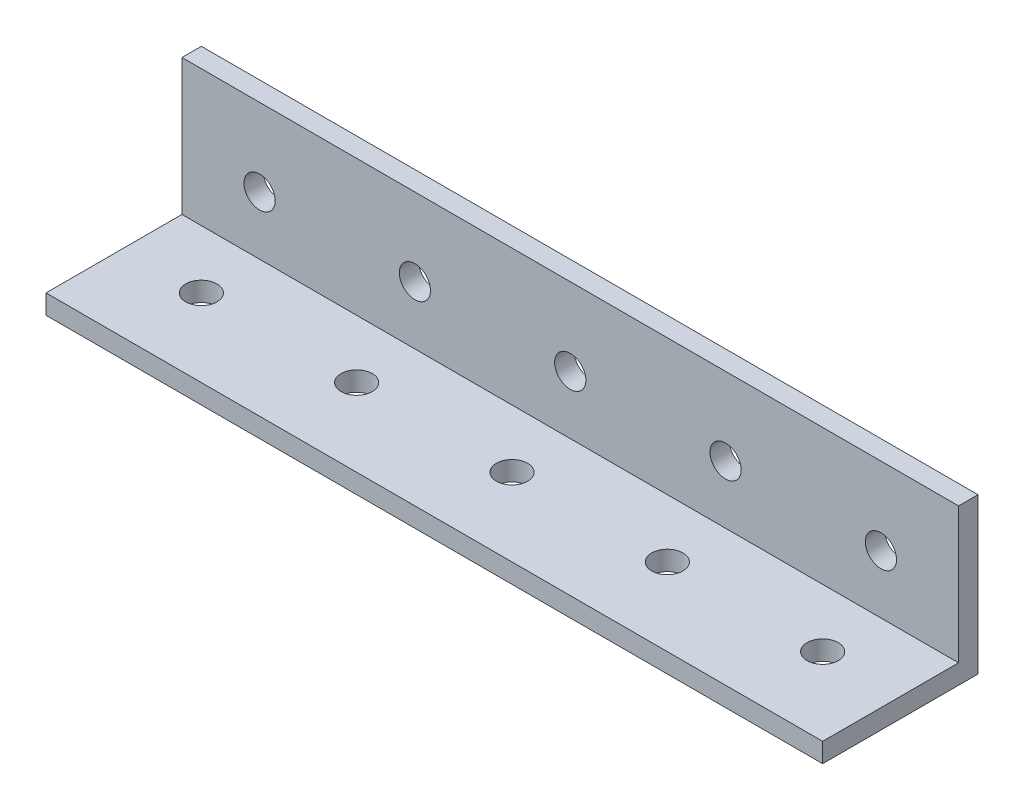
ISO-10303-21;
HEADER;
FILE_DESCRIPTION(('STEP AP214'),'2;1');
FILE_NAME('part.step','',(''),(''),'','','');
FILE_SCHEMA(('AUTOMOTIVE_DESIGN { 1 0 10303 214 1 1 1 1 }'));
ENDSEC;
DATA;
#1=APPLICATION_CONTEXT('core data for automotive mechanical design processes');
#2=APPLICATION_PROTOCOL_DEFINITION('international standard','automotive_design',2000,#1);
#3=PRODUCT_CONTEXT('',#1,'mechanical');
#4=PRODUCT('Part','Part','',(#3));
#5=PRODUCT_RELATED_PRODUCT_CATEGORY('part','',(#4));
#6=PRODUCT_DEFINITION_FORMATION('','',#4);
#7=PRODUCT_DEFINITION_CONTEXT('part definition',#1,'design');
#8=PRODUCT_DEFINITION('design','',#6,#7);
#9=PRODUCT_DEFINITION_SHAPE('','',#8);
#10=(LENGTH_UNIT() NAMED_UNIT(*) SI_UNIT(.MILLI.,.METRE.));
#11=(NAMED_UNIT(*) PLANE_ANGLE_UNIT() SI_UNIT($,.RADIAN.));
#12=(NAMED_UNIT(*) SI_UNIT($,.STERADIAN.) SOLID_ANGLE_UNIT());
#13=UNCERTAINTY_MEASURE_WITH_UNIT(LENGTH_MEASURE(1.E-05),#10,'distance_accuracy_value','');
#14=(GEOMETRIC_REPRESENTATION_CONTEXT(3) GLOBAL_UNCERTAINTY_ASSIGNED_CONTEXT((#13)) GLOBAL_UNIT_ASSIGNED_CONTEXT((#10,
#11,#12)) REPRESENTATION_CONTEXT('',''));
#15=CARTESIAN_POINT('',(0.,0.,0.));
#16=DIRECTION('',(0.,0.,1.));
#17=DIRECTION('',(1.,0.,0.));
#18=AXIS2_PLACEMENT_3D('',#15,#16,#17);
#19=CARTESIAN_POINT('',(12.7,12.7,25.4));
#20=DIRECTION('',(0.,0.,-1.));
#21=DIRECTION('',(-1.,0.,0.));
#22=AXIS2_PLACEMENT_3D('',#19,#20,#21);
#23=CYLINDRICAL_SURFACE('',#22,2.5527);
#24=CARTESIAN_POINT('',(12.7,12.7,0.));
#25=DIRECTION('',(0.,0.,1.));
#26=DIRECTION('',(1.,0.,0.));
#27=AXIS2_PLACEMENT_3D('',#24,#25,#26);
#28=CIRCLE('',#27,2.5527);
#29=CARTESIAN_POINT('',(15.2527,12.7,0.));
#30=VERTEX_POINT('',#29);
#31=EDGE_CURVE('E233',#30,#30,#28,.T.);
#32=ORIENTED_EDGE('',*,*,#31,.F.);
#33=EDGE_LOOP('',(#32));
#34=FACE_BOUND('',#33,.T.);
#35=CARTESIAN_POINT('',(12.7,12.7,3.175));
#36=DIRECTION('',(0.,0.,-1.));
#37=DIRECTION('',(1.,0.,0.));
#38=AXIS2_PLACEMENT_3D('',#35,#36,#37);
#39=CIRCLE('',#38,2.5527);
#40=CARTESIAN_POINT('',(15.2527,12.7,3.175));
#41=VERTEX_POINT('',#40);
#42=EDGE_CURVE('E263',#41,#41,#39,.T.);
#43=ORIENTED_EDGE('',*,*,#42,.F.);
#44=EDGE_LOOP('',(#43));
#45=FACE_BOUND('',#44,.T.);
#46=ADVANCED_FACE('F17',(#34,#45),#23,.F.);
#47=CARTESIAN_POINT('',(38.1,12.7,25.4));
#48=DIRECTION('',(0.,0.,-1.));
#49=DIRECTION('',(-1.,0.,0.));
#50=AXIS2_PLACEMENT_3D('',#47,#48,#49);
#51=CYLINDRICAL_SURFACE('',#50,2.5527);
#52=CARTESIAN_POINT('',(38.1,12.7,0.));
#53=DIRECTION('',(0.,0.,1.));
#54=DIRECTION('',(1.,0.,0.));
#55=AXIS2_PLACEMENT_3D('',#52,#53,#54);
#56=CIRCLE('',#55,2.5527);
#57=CARTESIAN_POINT('',(40.6527,12.7,0.));
#58=VERTEX_POINT('',#57);
#59=EDGE_CURVE('E236',#58,#58,#56,.T.);
#60=ORIENTED_EDGE('',*,*,#59,.F.);
#61=EDGE_LOOP('',(#60));
#62=FACE_BOUND('',#61,.T.);
#63=CARTESIAN_POINT('',(38.1,12.7,3.175));
#64=DIRECTION('',(0.,0.,-1.));
#65=DIRECTION('',(1.,0.,0.));
#66=AXIS2_PLACEMENT_3D('',#63,#64,#65);
#67=CIRCLE('',#66,2.5527);
#68=CARTESIAN_POINT('',(40.6527,12.7,3.175));
#69=VERTEX_POINT('',#68);
#70=EDGE_CURVE('E218',#69,#69,#67,.T.);
#71=ORIENTED_EDGE('',*,*,#70,.F.);
#72=EDGE_LOOP('',(#71));
#73=FACE_BOUND('',#72,.T.);
#74=ADVANCED_FACE('F349',(#62,#73),#51,.F.);
#75=CARTESIAN_POINT('',(63.5,12.7,25.4));
#76=DIRECTION('',(0.,0.,-1.));
#77=DIRECTION('',(-1.,0.,0.));
#78=AXIS2_PLACEMENT_3D('',#75,#76,#77);
#79=CYLINDRICAL_SURFACE('',#78,2.5527);
#80=CARTESIAN_POINT('',(63.5,12.7,0.));
#81=DIRECTION('',(0.,0.,1.));
#82=DIRECTION('',(1.,0.,0.));
#83=AXIS2_PLACEMENT_3D('',#80,#81,#82);
#84=CIRCLE('',#83,2.5527);
#85=CARTESIAN_POINT('',(66.0527,12.7,0.));
#86=VERTEX_POINT('',#85);
#87=EDGE_CURVE('E239',#86,#86,#84,.T.);
#88=ORIENTED_EDGE('',*,*,#87,.F.);
#89=EDGE_LOOP('',(#88));
#90=FACE_BOUND('',#89,.T.);
#91=CARTESIAN_POINT('',(63.5,12.7,3.175));
#92=DIRECTION('',(0.,0.,-1.));
#93=DIRECTION('',(1.,0.,0.));
#94=AXIS2_PLACEMENT_3D('',#91,#92,#93);
#95=CIRCLE('',#94,2.5527);
#96=CARTESIAN_POINT('',(66.0527,12.7,3.175));
#97=VERTEX_POINT('',#96);
#98=EDGE_CURVE('E215',#97,#97,#95,.T.);
#99=ORIENTED_EDGE('',*,*,#98,.F.);
#100=EDGE_LOOP('',(#99));
#101=FACE_BOUND('',#100,.T.);
#102=ADVANCED_FACE('F354',(#90,#101),#79,.F.);
#103=CARTESIAN_POINT('',(88.9,12.7,25.4));
#104=DIRECTION('',(0.,0.,-1.));
#105=DIRECTION('',(-1.,0.,0.));
#106=AXIS2_PLACEMENT_3D('',#103,#104,#105);
#107=CYLINDRICAL_SURFACE('',#106,2.5527);
#108=CARTESIAN_POINT('',(88.9,12.7,0.));
#109=DIRECTION('',(0.,0.,1.));
#110=DIRECTION('',(1.,0.,0.));
#111=AXIS2_PLACEMENT_3D('',#108,#109,#110);
#112=CIRCLE('',#111,2.5527);
#113=CARTESIAN_POINT('',(91.4527,12.7,0.));
#114=VERTEX_POINT('',#113);
#115=EDGE_CURVE('E208',#114,#114,#112,.T.);
#116=ORIENTED_EDGE('',*,*,#115,.F.);
#117=EDGE_LOOP('',(#116));
#118=FACE_BOUND('',#117,.T.);
#119=CARTESIAN_POINT('',(88.9,12.7,3.175));
#120=DIRECTION('',(0.,0.,-1.));
#121=DIRECTION('',(1.,0.,0.));
#122=AXIS2_PLACEMENT_3D('',#119,#120,#121);
#123=CIRCLE('',#122,2.5527);
#124=CARTESIAN_POINT('',(91.4527,12.7,3.175));
#125=VERTEX_POINT('',#124);
#126=EDGE_CURVE('E42',#125,#125,#123,.T.);
#127=ORIENTED_EDGE('',*,*,#126,.F.);
#128=EDGE_LOOP('',(#127));
#129=FACE_BOUND('',#128,.T.);
#130=ADVANCED_FACE('F342',(#118,#129),#107,.F.);
#131=CARTESIAN_POINT('',(114.3,12.7,25.4));
#132=DIRECTION('',(0.,0.,-1.));
#133=DIRECTION('',(-1.,0.,0.));
#134=AXIS2_PLACEMENT_3D('',#131,#132,#133);
#135=CYLINDRICAL_SURFACE('',#134,2.5527);
#136=CARTESIAN_POINT('',(114.3,12.7,0.));
#137=DIRECTION('',(0.,0.,1.));
#138=DIRECTION('',(1.,0.,0.));
#139=AXIS2_PLACEMENT_3D('',#136,#137,#138);
#140=CIRCLE('',#139,2.5527);
#141=CARTESIAN_POINT('',(116.8527,12.7,0.));
#142=VERTEX_POINT('',#141);
#143=EDGE_CURVE('E204',#142,#142,#140,.T.);
#144=ORIENTED_EDGE('',*,*,#143,.F.);
#145=EDGE_LOOP('',(#144));
#146=FACE_BOUND('',#145,.T.);
#147=CARTESIAN_POINT('',(114.3,12.7,3.175));
#148=DIRECTION('',(0.,0.,-1.));
#149=DIRECTION('',(1.,0.,0.));
#150=AXIS2_PLACEMENT_3D('',#147,#148,#149);
#151=CIRCLE('',#150,2.5527);
#152=CARTESIAN_POINT('',(116.8527,12.7,3.175));
#153=VERTEX_POINT('',#152);
#154=EDGE_CURVE('E35',#153,#153,#151,.T.);
#155=ORIENTED_EDGE('',*,*,#154,.F.);
#156=EDGE_LOOP('',(#155));
#157=FACE_BOUND('',#156,.T.);
#158=ADVANCED_FACE('F332',(#146,#157),#135,.F.);
#159=CARTESIAN_POINT('',(12.7,1126.04930693996,12.7));
#160=DIRECTION('',(0.,-1.,0.));
#161=DIRECTION('',(0.,0.,-1.));
#162=AXIS2_PLACEMENT_3D('',#159,#160,#161);
#163=CYLINDRICAL_SURFACE('',#162,2.5527);
#164=CARTESIAN_POINT('',(12.7,3.17499999999993,12.7));
#165=DIRECTION('',(0.,-1.,0.));
#166=DIRECTION('',(0.,0.,-1.));
#167=AXIS2_PLACEMENT_3D('',#164,#165,#166);
#168=CIRCLE('',#167,2.5527);
#169=CARTESIAN_POINT('',(12.7,3.17499999999993,10.1473));
#170=VERTEX_POINT('',#169);
#171=EDGE_CURVE('E311',#170,#170,#168,.T.);
#172=ORIENTED_EDGE('',*,*,#171,.F.);
#173=EDGE_LOOP('',(#172));
#174=FACE_BOUND('',#173,.T.);
#175=CARTESIAN_POINT('',(12.7,0.,12.7));
#176=DIRECTION('',(0.,-1.,0.));
#177=DIRECTION('',(0.,0.,-1.));
#178=AXIS2_PLACEMENT_3D('',#175,#176,#177);
#179=CIRCLE('',#178,2.5527);
#180=CARTESIAN_POINT('',(12.7,0.,10.1473));
#181=VERTEX_POINT('',#180);
#182=EDGE_CURVE('E194',#181,#181,#179,.T.);
#183=ORIENTED_EDGE('',*,*,#182,.T.);
#184=EDGE_LOOP('',(#183));
#185=FACE_BOUND('',#184,.T.);
#186=ADVANCED_FACE('F329',(#174,#185),#163,.F.);
#187=CARTESIAN_POINT('',(38.1,1126.04930693996,12.7));
#188=DIRECTION('',(0.,-1.,0.));
#189=DIRECTION('',(0.,0.,-1.));
#190=AXIS2_PLACEMENT_3D('',#187,#188,#189);
#191=CYLINDRICAL_SURFACE('',#190,2.5527);
#192=CARTESIAN_POINT('',(38.1,3.17499999999993,12.7));
#193=DIRECTION('',(0.,-1.,0.));
#194=DIRECTION('',(0.,0.,-1.));
#195=AXIS2_PLACEMENT_3D('',#192,#193,#194);
#196=CIRCLE('',#195,2.5527);
#197=CARTESIAN_POINT('',(38.1,3.17499999999993,10.1473));
#198=VERTEX_POINT('',#197);
#199=EDGE_CURVE('E315',#198,#198,#196,.T.);
#200=ORIENTED_EDGE('',*,*,#199,.F.);
#201=EDGE_LOOP('',(#200));
#202=FACE_BOUND('',#201,.T.);
#203=CARTESIAN_POINT('',(38.1,0.,12.7));
#204=DIRECTION('',(0.,-1.,0.));
#205=DIRECTION('',(0.,0.,-1.));
#206=AXIS2_PLACEMENT_3D('',#203,#204,#205);
#207=CIRCLE('',#206,2.5527);
#208=CARTESIAN_POINT('',(38.1,0.,10.1473));
#209=VERTEX_POINT('',#208);
#210=EDGE_CURVE('E200',#209,#209,#207,.T.);
#211=ORIENTED_EDGE('',*,*,#210,.T.);
#212=EDGE_LOOP('',(#211));
#213=FACE_BOUND('',#212,.T.);
#214=ADVANCED_FACE('F331',(#202,#213),#191,.F.);
#215=CARTESIAN_POINT('',(63.5,1126.04930693996,12.7));
#216=DIRECTION('',(0.,-1.,0.));
#217=DIRECTION('',(0.,0.,-1.));
#218=AXIS2_PLACEMENT_3D('',#215,#216,#217);
#219=CYLINDRICAL_SURFACE('',#218,2.5527);
#220=CARTESIAN_POINT('',(63.5,3.17499999999993,12.7));
#221=DIRECTION('',(0.,-1.,0.));
#222=DIRECTION('',(0.,0.,-1.));
#223=AXIS2_PLACEMENT_3D('',#220,#221,#222);
#224=CIRCLE('',#223,2.5527);
#225=CARTESIAN_POINT('',(63.5,3.17499999999993,10.1473));
#226=VERTEX_POINT('',#225);
#227=EDGE_CURVE('E178',#226,#226,#224,.T.);
#228=ORIENTED_EDGE('',*,*,#227,.F.);
#229=EDGE_LOOP('',(#228));
#230=FACE_BOUND('',#229,.T.);
#231=CARTESIAN_POINT('',(63.5,0.,12.7));
#232=DIRECTION('',(0.,-1.,0.));
#233=DIRECTION('',(0.,0.,-1.));
#234=AXIS2_PLACEMENT_3D('',#231,#232,#233);
#235=CIRCLE('',#234,2.5527);
#236=CARTESIAN_POINT('',(63.5,0.,10.1473));
#237=VERTEX_POINT('',#236);
#238=EDGE_CURVE('E203',#237,#237,#235,.T.);
#239=ORIENTED_EDGE('',*,*,#238,.T.);
#240=EDGE_LOOP('',(#239));
#241=FACE_BOUND('',#240,.T.);
#242=ADVANCED_FACE('F320',(#230,#241),#219,.F.);
#243=CARTESIAN_POINT('',(88.9,1126.04930693996,12.7));
#244=DIRECTION('',(0.,-1.,0.));
#245=DIRECTION('',(0.,0.,-1.));
#246=AXIS2_PLACEMENT_3D('',#243,#244,#245);
#247=CYLINDRICAL_SURFACE('',#246,2.5527);
#248=CARTESIAN_POINT('',(88.9,3.17499999999993,12.7));
#249=DIRECTION('',(0.,-1.,0.));
#250=DIRECTION('',(0.,0.,-1.));
#251=AXIS2_PLACEMENT_3D('',#248,#249,#250);
#252=CIRCLE('',#251,2.5527);
#253=CARTESIAN_POINT('',(88.9,3.17499999999993,10.1473));
#254=VERTEX_POINT('',#253);
#255=EDGE_CURVE('E170',#254,#254,#252,.T.);
#256=ORIENTED_EDGE('',*,*,#255,.F.);
#257=EDGE_LOOP('',(#256));
#258=FACE_BOUND('',#257,.T.);
#259=CARTESIAN_POINT('',(88.9,0.,12.7));
#260=DIRECTION('',(0.,-1.,0.));
#261=DIRECTION('',(0.,0.,-1.));
#262=AXIS2_PLACEMENT_3D('',#259,#260,#261);
#263=CIRCLE('',#262,2.5527);
#264=CARTESIAN_POINT('',(88.9,0.,10.1473));
#265=VERTEX_POINT('',#264);
#266=EDGE_CURVE('E219',#265,#265,#263,.T.);
#267=ORIENTED_EDGE('',*,*,#266,.T.);
#268=EDGE_LOOP('',(#267));
#269=FACE_BOUND('',#268,.T.);
#270=ADVANCED_FACE('F375',(#258,#269),#247,.F.);
#271=CARTESIAN_POINT('',(114.3,1126.04930693996,12.7));
#272=DIRECTION('',(0.,-1.,0.));
#273=DIRECTION('',(0.,0.,-1.));
#274=AXIS2_PLACEMENT_3D('',#271,#272,#273);
#275=CYLINDRICAL_SURFACE('',#274,2.5527);
#276=CARTESIAN_POINT('',(114.3,3.17499999999993,12.7));
#277=DIRECTION('',(0.,-1.,0.));
#278=DIRECTION('',(0.,0.,-1.));
#279=AXIS2_PLACEMENT_3D('',#276,#277,#278);
#280=CIRCLE('',#279,2.5527);
#281=CARTESIAN_POINT('',(114.3,3.17499999999993,10.1473));
#282=VERTEX_POINT('',#281);
#283=EDGE_CURVE('E164',#282,#282,#280,.T.);
#284=ORIENTED_EDGE('',*,*,#283,.F.);
#285=EDGE_LOOP('',(#284));
#286=FACE_BOUND('',#285,.T.);
#287=CARTESIAN_POINT('',(114.3,0.,12.7));
#288=DIRECTION('',(0.,-1.,0.));
#289=DIRECTION('',(0.,0.,-1.));
#290=AXIS2_PLACEMENT_3D('',#287,#288,#289);
#291=CIRCLE('',#290,2.5527);
#292=CARTESIAN_POINT('',(114.3,0.,10.1473));
#293=VERTEX_POINT('',#292);
#294=EDGE_CURVE('E222',#293,#293,#291,.T.);
#295=ORIENTED_EDGE('',*,*,#294,.T.);
#296=EDGE_LOOP('',(#295));
#297=FACE_BOUND('',#296,.T.);
#298=ADVANCED_FACE('F372',(#286,#297),#275,.F.);
#299=CARTESIAN_POINT('',(0.,50.8,12.7));
#300=DIRECTION('',(1.,0.,0.));
#301=DIRECTION('',(0.,1.,0.));
#302=AXIS2_PLACEMENT_3D('',#299,#300,#301);
#303=PLANE('',#302);
#304=DIRECTION('',(0.,0.,1.));
#305=VECTOR('',#304,1.);
#306=CARTESIAN_POINT('',(0.,3.175,14.2875));
#307=LINE('',#306,#305);
#308=CARTESIAN_POINT('',(0.,3.175,3.175));
#309=VERTEX_POINT('',#308);
#310=CARTESIAN_POINT('',(0.,3.175,25.4));
#311=VERTEX_POINT('',#310);
#312=EDGE_CURVE('E169',#309,#311,#307,.T.);
#313=ORIENTED_EDGE('',*,*,#312,.F.);
#314=DIRECTION('',(0.,1.,0.));
#315=VECTOR('',#314,1.);
#316=CARTESIAN_POINT('',(0.,14.2875,3.175));
#317=LINE('',#316,#315);
#318=CARTESIAN_POINT('',(0.,25.4,3.175));
#319=VERTEX_POINT('',#318);
#320=EDGE_CURVE('E25',#309,#319,#317,.T.);
#321=ORIENTED_EDGE('',*,*,#320,.T.);
#322=DIRECTION('',(0.,0.,-1.));
#323=VECTOR('',#322,1.);
#324=CARTESIAN_POINT('',(0.,25.4,1.5875));
#325=LINE('',#324,#323);
#326=CARTESIAN_POINT('',(0.,25.4,0.));
#327=VERTEX_POINT('',#326);
#328=EDGE_CURVE('E255',#319,#327,#325,.T.);
#329=ORIENTED_EDGE('',*,*,#328,.T.);
#330=DIRECTION('',(0.,1.,0.));
#331=VECTOR('',#330,1.);
#332=CARTESIAN_POINT('',(0.,12.7,0.));
#333=LINE('',#332,#331);
#334=CARTESIAN_POINT('',(0.,0.,0.));
#335=VERTEX_POINT('',#334);
#336=EDGE_CURVE('E207',#335,#327,#333,.T.);
#337=ORIENTED_EDGE('',*,*,#336,.F.);
#338=DIRECTION('',(0.,0.,1.));
#339=VECTOR('',#338,1.);
#340=CARTESIAN_POINT('',(0.,0.,12.7));
#341=LINE('',#340,#339);
#342=CARTESIAN_POINT('',(0.,0.,25.4));
#343=VERTEX_POINT('',#342);
#344=EDGE_CURVE('E225',#335,#343,#341,.T.);
#345=ORIENTED_EDGE('',*,*,#344,.T.);
#346=DIRECTION('',(0.,-1.,0.));
#347=VECTOR('',#346,1.);
#348=CARTESIAN_POINT('',(0.,1.5875,25.4));
#349=LINE('',#348,#347);
#350=EDGE_CURVE('E199',#311,#343,#349,.T.);
#351=ORIENTED_EDGE('',*,*,#350,.F.);
#352=EDGE_LOOP('',(#313,#321,#329,#337,#345,#351));
#353=FACE_BOUND('',#352,.T.);
#354=ADVANCED_FACE('F275',(#353),#303,.F.);
#355=CARTESIAN_POINT('',(127.,50.8,12.7));
#356=DIRECTION('',(1.,0.,0.));
#357=DIRECTION('',(0.,1.,0.));
#358=AXIS2_PLACEMENT_3D('',#355,#356,#357);
#359=PLANE('',#358);
#360=DIRECTION('',(0.,0.,1.));
#361=VECTOR('',#360,1.);
#362=CARTESIAN_POINT('',(127.,3.175,14.2875));
#363=LINE('',#362,#361);
#364=CARTESIAN_POINT('',(127.,3.175,3.175));
#365=VERTEX_POINT('',#364);
#366=CARTESIAN_POINT('',(127.,3.175,25.4));
#367=VERTEX_POINT('',#366);
#368=EDGE_CURVE('E185',#365,#367,#363,.T.);
#369=ORIENTED_EDGE('',*,*,#368,.T.);
#370=DIRECTION('',(0.,-1.,0.));
#371=VECTOR('',#370,1.);
#372=CARTESIAN_POINT('',(127.,1.5875,25.4));
#373=LINE('',#372,#371);
#374=CARTESIAN_POINT('',(127.,0.,25.4));
#375=VERTEX_POINT('',#374);
#376=EDGE_CURVE('E190',#367,#375,#373,.T.);
#377=ORIENTED_EDGE('',*,*,#376,.T.);
#378=DIRECTION('',(0.,0.,1.));
#379=VECTOR('',#378,1.);
#380=CARTESIAN_POINT('',(127.,0.,12.7));
#381=LINE('',#380,#379);
#382=CARTESIAN_POINT('',(127.,0.,0.));
#383=VERTEX_POINT('',#382);
#384=EDGE_CURVE('E230',#383,#375,#381,.T.);
#385=ORIENTED_EDGE('',*,*,#384,.F.);
#386=DIRECTION('',(0.,1.,0.));
#387=VECTOR('',#386,1.);
#388=CARTESIAN_POINT('',(127.,12.7,0.));
#389=LINE('',#388,#387);
#390=CARTESIAN_POINT('',(127.,25.4,0.));
#391=VERTEX_POINT('',#390);
#392=EDGE_CURVE('E251',#383,#391,#389,.T.);
#393=ORIENTED_EDGE('',*,*,#392,.T.);
#394=DIRECTION('',(0.,0.,-1.));
#395=VECTOR('',#394,1.);
#396=CARTESIAN_POINT('',(127.,25.4,1.5875));
#397=LINE('',#396,#395);
#398=CARTESIAN_POINT('',(127.,25.4,3.175));
#399=VERTEX_POINT('',#398);
#400=EDGE_CURVE('E262',#399,#391,#397,.T.);
#401=ORIENTED_EDGE('',*,*,#400,.F.);
#402=DIRECTION('',(0.,1.,0.));
#403=VECTOR('',#402,1.);
#404=CARTESIAN_POINT('',(127.,14.2875,3.175));
#405=LINE('',#404,#403);
#406=EDGE_CURVE('E11',#365,#399,#405,.T.);
#407=ORIENTED_EDGE('',*,*,#406,.F.);
#408=EDGE_LOOP('',(#369,#377,#385,#393,#401,#407));
#409=FACE_BOUND('',#408,.T.);
#410=ADVANCED_FACE('F303',(#409),#359,.T.);
#411=CARTESIAN_POINT('',(127.,14.2875,3.175));
#412=DIRECTION('',(0.,0.,1.));
#413=DIRECTION('',(1.,0.,0.));
#414=AXIS2_PLACEMENT_3D('',#411,#412,#413);
#415=PLANE('',#414);
#416=ORIENTED_EDGE('',*,*,#320,.F.);
#417=DIRECTION('',(-1.,0.,0.));
#418=VECTOR('',#417,1.);
#419=CARTESIAN_POINT('',(127.,3.175,3.175));
#420=LINE('',#419,#418);
#421=EDGE_CURVE('E189',#365,#309,#420,.T.);
#422=ORIENTED_EDGE('',*,*,#421,.F.);
#423=ORIENTED_EDGE('',*,*,#406,.T.);
#424=DIRECTION('',(-1.,0.,0.));
#425=VECTOR('',#424,1.);
#426=CARTESIAN_POINT('',(127.,25.4,3.175));
#427=LINE('',#426,#425);
#428=EDGE_CURVE('E258',#399,#319,#427,.T.);
#429=ORIENTED_EDGE('',*,*,#428,.T.);
#430=EDGE_LOOP('',(#416,#422,#423,#429));
#431=FACE_BOUND('',#430,.T.);
#432=ORIENTED_EDGE('',*,*,#154,.T.);
#433=EDGE_LOOP('',(#432));
#434=FACE_BOUND('',#433,.T.);
#435=ORIENTED_EDGE('',*,*,#126,.T.);
#436=EDGE_LOOP('',(#435));
#437=FACE_BOUND('',#436,.T.);
#438=ORIENTED_EDGE('',*,*,#98,.T.);
#439=EDGE_LOOP('',(#438));
#440=FACE_BOUND('',#439,.T.);
#441=ORIENTED_EDGE('',*,*,#70,.T.);
#442=EDGE_LOOP('',(#441));
#443=FACE_BOUND('',#442,.T.);
#444=ORIENTED_EDGE('',*,*,#42,.T.);
#445=EDGE_LOOP('',(#444));
#446=FACE_BOUND('',#445,.T.);
#447=ADVANCED_FACE('F280',(#431,#434,#437,#440,#443,#446),#415,.T.);
#448=CARTESIAN_POINT('',(127.,25.4,1.5875));
#449=DIRECTION('',(0.,1.,0.));
#450=DIRECTION('',(1.,0.,0.));
#451=AXIS2_PLACEMENT_3D('',#448,#449,#450);
#452=PLANE('',#451);
#453=ORIENTED_EDGE('',*,*,#328,.F.);
#454=ORIENTED_EDGE('',*,*,#428,.F.);
#455=ORIENTED_EDGE('',*,*,#400,.T.);
#456=DIRECTION('',(-1.,0.,0.));
#457=VECTOR('',#456,1.);
#458=CARTESIAN_POINT('',(127.,25.4,0.));
#459=LINE('',#458,#457);
#460=EDGE_CURVE('E247',#391,#327,#459,.T.);
#461=ORIENTED_EDGE('',*,*,#460,.T.);
#462=EDGE_LOOP('',(#453,#454,#455,#461));
#463=FACE_BOUND('',#462,.T.);
#464=ADVANCED_FACE('F283',(#463),#452,.T.);
#465=CARTESIAN_POINT('',(127.,12.7,0.));
#466=DIRECTION('',(0.,0.,1.));
#467=DIRECTION('',(1.,0.,0.));
#468=AXIS2_PLACEMENT_3D('',#465,#466,#467);
#469=PLANE('',#468);
#470=ORIENTED_EDGE('',*,*,#336,.T.);
#471=ORIENTED_EDGE('',*,*,#460,.F.);
#472=ORIENTED_EDGE('',*,*,#392,.F.);
#473=DIRECTION('',(-1.,0.,0.));
#474=VECTOR('',#473,1.);
#475=CARTESIAN_POINT('',(127.,0.,0.));
#476=LINE('',#475,#474);
#477=EDGE_CURVE('E226',#383,#335,#476,.T.);
#478=ORIENTED_EDGE('',*,*,#477,.T.);
#479=EDGE_LOOP('',(#470,#471,#472,#478));
#480=FACE_BOUND('',#479,.T.);
#481=ORIENTED_EDGE('',*,*,#143,.T.);
#482=EDGE_LOOP('',(#481));
#483=FACE_BOUND('',#482,.T.);
#484=ORIENTED_EDGE('',*,*,#115,.T.);
#485=EDGE_LOOP('',(#484));
#486=FACE_BOUND('',#485,.T.);
#487=ORIENTED_EDGE('',*,*,#87,.T.);
#488=EDGE_LOOP('',(#487));
#489=FACE_BOUND('',#488,.T.);
#490=ORIENTED_EDGE('',*,*,#59,.T.);
#491=EDGE_LOOP('',(#490));
#492=FACE_BOUND('',#491,.T.);
#493=ORIENTED_EDGE('',*,*,#31,.T.);
#494=EDGE_LOOP('',(#493));
#495=FACE_BOUND('',#494,.T.);
#496=ADVANCED_FACE('F286',(#480,#483,#486,#489,#492,#495),#469,.F.);
#497=CARTESIAN_POINT('',(127.,0.,12.7));
#498=DIRECTION('',(0.,-1.,0.));
#499=DIRECTION('',(0.,0.,-1.));
#500=AXIS2_PLACEMENT_3D('',#497,#498,#499);
#501=PLANE('',#500);
#502=ORIENTED_EDGE('',*,*,#344,.F.);
#503=ORIENTED_EDGE('',*,*,#477,.F.);
#504=ORIENTED_EDGE('',*,*,#384,.T.);
#505=DIRECTION('',(-1.,0.,0.));
#506=VECTOR('',#505,1.);
#507=CARTESIAN_POINT('',(127.,0.,25.4));
#508=LINE('',#507,#506);
#509=EDGE_CURVE('E195',#375,#343,#508,.T.);
#510=ORIENTED_EDGE('',*,*,#509,.T.);
#511=EDGE_LOOP('',(#502,#503,#504,#510));
#512=FACE_BOUND('',#511,.T.);
#513=ORIENTED_EDGE('',*,*,#294,.F.);
#514=EDGE_LOOP('',(#513));
#515=FACE_BOUND('',#514,.T.);
#516=ORIENTED_EDGE('',*,*,#266,.F.);
#517=EDGE_LOOP('',(#516));
#518=FACE_BOUND('',#517,.T.);
#519=ORIENTED_EDGE('',*,*,#238,.F.);
#520=EDGE_LOOP('',(#519));
#521=FACE_BOUND('',#520,.T.);
#522=ORIENTED_EDGE('',*,*,#210,.F.);
#523=EDGE_LOOP('',(#522));
#524=FACE_BOUND('',#523,.T.);
#525=ORIENTED_EDGE('',*,*,#182,.F.);
#526=EDGE_LOOP('',(#525));
#527=FACE_BOUND('',#526,.T.);
#528=ADVANCED_FACE('F294',(#512,#515,#518,#521,#524,#527),#501,.T.);
#529=CARTESIAN_POINT('',(127.,1.5875,25.4));
#530=DIRECTION('',(0.,0.,-1.));
#531=DIRECTION('',(0.,-1.,0.));
#532=AXIS2_PLACEMENT_3D('',#529,#530,#531);
#533=PLANE('',#532);
#534=ORIENTED_EDGE('',*,*,#350,.T.);
#535=ORIENTED_EDGE('',*,*,#509,.F.);
#536=ORIENTED_EDGE('',*,*,#376,.F.);
#537=DIRECTION('',(-1.,0.,0.));
#538=VECTOR('',#537,1.);
#539=CARTESIAN_POINT('',(127.,3.175,25.4));
#540=LINE('',#539,#538);
#541=EDGE_CURVE('E176',#367,#311,#540,.T.);
#542=ORIENTED_EDGE('',*,*,#541,.T.);
#543=EDGE_LOOP('',(#534,#535,#536,#542));
#544=FACE_BOUND('',#543,.T.);
#545=ADVANCED_FACE('F298',(#544),#533,.F.);
#546=CARTESIAN_POINT('',(127.,3.175,14.2875));
#547=DIRECTION('',(0.,-1.,0.));
#548=DIRECTION('',(0.,0.,-1.));
#549=AXIS2_PLACEMENT_3D('',#546,#547,#548);
#550=PLANE('',#549);
#551=ORIENTED_EDGE('',*,*,#312,.T.);
#552=ORIENTED_EDGE('',*,*,#541,.F.);
#553=ORIENTED_EDGE('',*,*,#368,.F.);
#554=ORIENTED_EDGE('',*,*,#421,.T.);
#555=EDGE_LOOP('',(#551,#552,#553,#554));
#556=FACE_BOUND('',#555,.T.);
#557=ORIENTED_EDGE('',*,*,#283,.T.);
#558=EDGE_LOOP('',(#557));
#559=FACE_BOUND('',#558,.T.);
#560=ORIENTED_EDGE('',*,*,#255,.T.);
#561=EDGE_LOOP('',(#560));
#562=FACE_BOUND('',#561,.T.);
#563=ORIENTED_EDGE('',*,*,#227,.T.);
#564=EDGE_LOOP('',(#563));
#565=FACE_BOUND('',#564,.T.);
#566=ORIENTED_EDGE('',*,*,#199,.T.);
#567=EDGE_LOOP('',(#566));
#568=FACE_BOUND('',#567,.T.);
#569=ORIENTED_EDGE('',*,*,#171,.T.);
#570=EDGE_LOOP('',(#569));
#571=FACE_BOUND('',#570,.T.);
#572=ADVANCED_FACE('F165',(#556,#559,#562,#565,#568,#571),#550,.F.);
#573=CLOSED_SHELL('',(#46,#74,#102,#130,#158,#186,#214,#242,#270,#298,#354,#410,#447,#464,#496,
#528,#545,#572));
#574=MANIFOLD_SOLID_BREP('B1',#573);
#575=ADVANCED_BREP_SHAPE_REPRESENTATION('',(#18,#574),#14);
#576=SHAPE_DEFINITION_REPRESENTATION(#9,#575);
ENDSEC;
END-ISO-10303-21;
